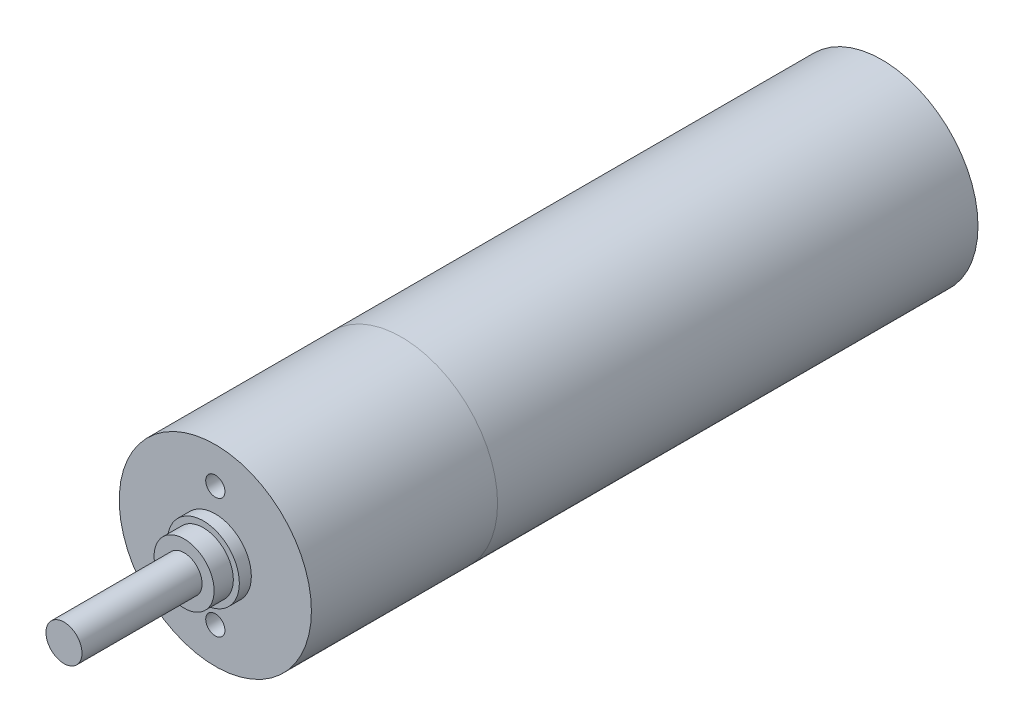
ISO-10303-21;
HEADER;
FILE_DESCRIPTION(('STEP AP214'),'2;1');
FILE_NAME('part.step','',(''),(''),'','','');
FILE_SCHEMA(('AUTOMOTIVE_DESIGN { 1 0 10303 214 1 1 1 1 }'));
ENDSEC;
DATA;
#1=APPLICATION_CONTEXT('core data for automotive mechanical design processes');
#2=APPLICATION_PROTOCOL_DEFINITION('international standard','automotive_design',2000,#1);
#3=PRODUCT_CONTEXT('',#1,'mechanical');
#4=PRODUCT('Part','Part','',(#3));
#5=PRODUCT_RELATED_PRODUCT_CATEGORY('part','',(#4));
#6=PRODUCT_DEFINITION_FORMATION('','',#4);
#7=PRODUCT_DEFINITION_CONTEXT('part definition',#1,'design');
#8=PRODUCT_DEFINITION('design','',#6,#7);
#9=PRODUCT_DEFINITION_SHAPE('','',#8);
#10=(LENGTH_UNIT() NAMED_UNIT(*) SI_UNIT(.MILLI.,.METRE.));
#11=(NAMED_UNIT(*) PLANE_ANGLE_UNIT() SI_UNIT($,.RADIAN.));
#12=(NAMED_UNIT(*) SI_UNIT($,.STERADIAN.) SOLID_ANGLE_UNIT());
#13=UNCERTAINTY_MEASURE_WITH_UNIT(LENGTH_MEASURE(1.E-05),#10,'distance_accuracy_value','');
#14=(GEOMETRIC_REPRESENTATION_CONTEXT(3) GLOBAL_UNCERTAINTY_ASSIGNED_CONTEXT((#13)) GLOBAL_UNIT_ASSIGNED_CONTEXT((#10,
#11,#12)) REPRESENTATION_CONTEXT('',''));
#15=CARTESIAN_POINT('',(0.,0.,0.));
#16=DIRECTION('',(0.,0.,1.));
#17=DIRECTION('',(1.,0.,0.));
#18=AXIS2_PLACEMENT_3D('',#15,#16,#17);
#19=CARTESIAN_POINT('',(0.,0.,58.1));
#20=DIRECTION('',(0.,0.,1.));
#21=DIRECTION('',(1.,0.,0.));
#22=AXIS2_PLACEMENT_3D('',#19,#20,#21);
#23=PLANE('',#22);
#24=CARTESIAN_POINT('',(0.,0.,58.1));
#25=DIRECTION('',(0.,0.,1.));
#26=DIRECTION('',(1.,0.,0.));
#27=AXIS2_PLACEMENT_3D('',#24,#25,#26);
#28=CIRCLE('',#27,2.5);
#29=CARTESIAN_POINT('',(2.5,0.,58.1));
#30=VERTEX_POINT('',#29);
#31=EDGE_CURVE('E84',#30,#30,#28,.T.);
#32=ORIENTED_EDGE('',*,*,#31,.T.);
#33=EDGE_LOOP('',(#32));
#34=FACE_BOUND('',#33,.T.);
#35=CARTESIAN_POINT('',(0.,0.,58.1));
#36=DIRECTION('',(0.,0.,1.));
#37=DIRECTION('',(1.,0.,0.));
#38=AXIS2_PLACEMENT_3D('',#35,#36,#37);
#39=CIRCLE('',#38,1.5);
#40=CARTESIAN_POINT('',(1.5,0.,58.1));
#41=VERTEX_POINT('',#40);
#42=EDGE_CURVE('E77',#41,#41,#39,.T.);
#43=ORIENTED_EDGE('',*,*,#42,.F.);
#44=EDGE_LOOP('',(#43));
#45=FACE_BOUND('',#44,.T.);
#46=ADVANCED_FACE('F42',(#34,#45),#23,.T.);
#47=CARTESIAN_POINT('',(0.,0.,56.5));
#48=DIRECTION('',(0.,0.,1.));
#49=DIRECTION('',(1.,0.,0.));
#50=AXIS2_PLACEMENT_3D('',#47,#48,#49);
#51=PLANE('',#50);
#52=CARTESIAN_POINT('',(0.,0.,56.5));
#53=DIRECTION('',(0.,0.,1.));
#54=DIRECTION('',(1.,0.,0.));
#55=AXIS2_PLACEMENT_3D('',#52,#53,#54);
#56=CIRCLE('',#55,3.);
#57=CARTESIAN_POINT('',(3.,0.,56.5));
#58=VERTEX_POINT('',#57);
#59=EDGE_CURVE('E90',#58,#58,#56,.T.);
#60=ORIENTED_EDGE('',*,*,#59,.T.);
#61=EDGE_LOOP('',(#60));
#62=FACE_BOUND('',#61,.T.);
#63=CARTESIAN_POINT('',(0.,0.,56.5));
#64=DIRECTION('',(0.,0.,1.));
#65=DIRECTION('',(1.,0.,0.));
#66=AXIS2_PLACEMENT_3D('',#63,#64,#65);
#67=CIRCLE('',#66,2.5);
#68=CARTESIAN_POINT('',(2.5,0.,56.5));
#69=VERTEX_POINT('',#68);
#70=EDGE_CURVE('E81',#69,#69,#67,.T.);
#71=ORIENTED_EDGE('',*,*,#70,.F.);
#72=EDGE_LOOP('',(#71));
#73=FACE_BOUND('',#72,.T.);
#74=ADVANCED_FACE('F100',(#62,#73),#51,.T.);
#75=CARTESIAN_POINT('',(0.,0.,55.5));
#76=DIRECTION('',(0.,0.,1.));
#77=DIRECTION('',(1.,0.,0.));
#78=AXIS2_PLACEMENT_3D('',#75,#76,#77);
#79=PLANE('',#78);
#80=CARTESIAN_POINT('',(0.,5.,55.5));
#81=DIRECTION('',(0.,0.,1.));
#82=DIRECTION('',(1.,0.,0.));
#83=AXIS2_PLACEMENT_3D('',#80,#81,#82);
#84=CIRCLE('',#83,0.799999999999999);
#85=CARTESIAN_POINT('',(0.799999999999999,5.,55.5));
#86=VERTEX_POINT('',#85);
#87=EDGE_CURVE('E67',#86,#86,#84,.T.);
#88=ORIENTED_EDGE('',*,*,#87,.F.);
#89=EDGE_LOOP('',(#88));
#90=FACE_BOUND('',#89,.T.);
#91=CARTESIAN_POINT('',(0.,-5.,55.5));
#92=DIRECTION('',(0.,0.,1.));
#93=DIRECTION('',(1.,0.,0.));
#94=AXIS2_PLACEMENT_3D('',#91,#92,#93);
#95=CIRCLE('',#94,0.799999999999999);
#96=CARTESIAN_POINT('',(0.799999999999999,-5.,55.5));
#97=VERTEX_POINT('',#96);
#98=EDGE_CURVE('E66',#97,#97,#95,.T.);
#99=ORIENTED_EDGE('',*,*,#98,.F.);
#100=EDGE_LOOP('',(#99));
#101=FACE_BOUND('',#100,.T.);
#102=CARTESIAN_POINT('',(0.,0.,55.5));
#103=DIRECTION('',(0.,0.,1.));
#104=DIRECTION('',(1.,0.,0.));
#105=AXIS2_PLACEMENT_3D('',#102,#103,#104);
#106=CIRCLE('',#105,8.);
#107=CARTESIAN_POINT('',(8.,0.,55.5));
#108=VERTEX_POINT('',#107);
#109=EDGE_CURVE('E12',#108,#108,#106,.T.);
#110=ORIENTED_EDGE('',*,*,#109,.T.);
#111=EDGE_LOOP('',(#110));
#112=FACE_BOUND('',#111,.T.);
#113=CARTESIAN_POINT('',(0.,0.,55.5));
#114=DIRECTION('',(0.,0.,1.));
#115=DIRECTION('',(1.,0.,0.));
#116=AXIS2_PLACEMENT_3D('',#113,#114,#115);
#117=CIRCLE('',#116,3.);
#118=CARTESIAN_POINT('',(3.,0.,55.5));
#119=VERTEX_POINT('',#118);
#120=EDGE_CURVE('E87',#119,#119,#117,.T.);
#121=ORIENTED_EDGE('',*,*,#120,.F.);
#122=EDGE_LOOP('',(#121));
#123=FACE_BOUND('',#122,.T.);
#124=ADVANCED_FACE('F98',(#90,#101,#112,#123),#79,.T.);
#125=CARTESIAN_POINT('',(0.,0.,55.5));
#126=DIRECTION('',(0.,0.,-1.));
#127=DIRECTION('',(-1.,0.,0.));
#128=AXIS2_PLACEMENT_3D('',#125,#126,#127);
#129=CYLINDRICAL_SURFACE('',#128,8.);
#130=ORIENTED_EDGE('',*,*,#109,.F.);
#131=EDGE_LOOP('',(#130));
#132=FACE_BOUND('',#131,.T.);
#133=CARTESIAN_POINT('',(0.,0.,40.));
#134=DIRECTION('',(0.,0.,1.));
#135=DIRECTION('',(1.,0.,0.));
#136=AXIS2_PLACEMENT_3D('',#133,#134,#135);
#137=CIRCLE('',#136,8.);
#138=CARTESIAN_POINT('',(8.,0.,40.));
#139=VERTEX_POINT('',#138);
#140=EDGE_CURVE('E46',#139,#139,#137,.T.);
#141=ORIENTED_EDGE('',*,*,#140,.T.);
#142=EDGE_LOOP('',(#141));
#143=FACE_BOUND('',#142,.T.);
#144=ADVANCED_FACE('F44',(#132,#143),#129,.T.);
#145=CARTESIAN_POINT('',(0.,0.,40.));
#146=DIRECTION('',(0.,0.,1.));
#147=DIRECTION('',(1.,0.,0.));
#148=AXIS2_PLACEMENT_3D('',#145,#146,#147);
#149=PLANE('',#148);
#150=ORIENTED_EDGE('',*,*,#140,.F.);
#151=EDGE_LOOP('',(#150));
#152=FACE_BOUND('',#151,.T.);
#153=ADVANCED_FACE('F107',(#152),#149,.F.);
#154=CARTESIAN_POINT('',(0.,0.,56.5));
#155=DIRECTION('',(0.,0.,-1.));
#156=DIRECTION('',(-1.,0.,0.));
#157=AXIS2_PLACEMENT_3D('',#154,#155,#156);
#158=CYLINDRICAL_SURFACE('',#157,3.);
#159=ORIENTED_EDGE('',*,*,#59,.F.);
#160=EDGE_LOOP('',(#159));
#161=FACE_BOUND('',#160,.T.);
#162=ORIENTED_EDGE('',*,*,#120,.T.);
#163=EDGE_LOOP('',(#162));
#164=FACE_BOUND('',#163,.T.);
#165=ADVANCED_FACE('F96',(#161,#164),#158,.T.);
#166=CARTESIAN_POINT('',(0.,0.,58.1));
#167=DIRECTION('',(0.,0.,-1.));
#168=DIRECTION('',(-1.,0.,0.));
#169=AXIS2_PLACEMENT_3D('',#166,#167,#168);
#170=CYLINDRICAL_SURFACE('',#169,2.5);
#171=ORIENTED_EDGE('',*,*,#31,.F.);
#172=EDGE_LOOP('',(#171));
#173=FACE_BOUND('',#172,.T.);
#174=ORIENTED_EDGE('',*,*,#70,.T.);
#175=EDGE_LOOP('',(#174));
#176=FACE_BOUND('',#175,.T.);
#177=ADVANCED_FACE('F124',(#173,#176),#170,.T.);
#178=CARTESIAN_POINT('',(0.,0.,68.1));
#179=DIRECTION('',(0.,0.,-1.));
#180=DIRECTION('',(-1.,0.,0.));
#181=AXIS2_PLACEMENT_3D('',#178,#179,#180);
#182=CYLINDRICAL_SURFACE('',#181,1.5);
#183=CARTESIAN_POINT('',(0.,0.,68.1));
#184=DIRECTION('',(0.,0.,1.));
#185=DIRECTION('',(1.,0.,0.));
#186=AXIS2_PLACEMENT_3D('',#183,#184,#185);
#187=CIRCLE('',#186,1.5);
#188=CARTESIAN_POINT('',(1.5,0.,68.1));
#189=VERTEX_POINT('',#188);
#190=EDGE_CURVE('E78',#189,#189,#187,.T.);
#191=ORIENTED_EDGE('',*,*,#190,.F.);
#192=EDGE_LOOP('',(#191));
#193=FACE_BOUND('',#192,.T.);
#194=ORIENTED_EDGE('',*,*,#42,.T.);
#195=EDGE_LOOP('',(#194));
#196=FACE_BOUND('',#195,.T.);
#197=ADVANCED_FACE('F122',(#193,#196),#182,.T.);
#198=CARTESIAN_POINT('',(0.,0.,68.1));
#199=DIRECTION('',(0.,0.,1.));
#200=DIRECTION('',(1.,0.,0.));
#201=AXIS2_PLACEMENT_3D('',#198,#199,#200);
#202=PLANE('',#201);
#203=ORIENTED_EDGE('',*,*,#190,.T.);
#204=EDGE_LOOP('',(#203));
#205=FACE_BOUND('',#204,.T.);
#206=ADVANCED_FACE('F175',(#205),#202,.T.);
#207=CARTESIAN_POINT('',(0.,-5.,52.5));
#208=DIRECTION('',(0.,0.,1.));
#209=DIRECTION('',(1.,0.,0.));
#210=AXIS2_PLACEMENT_3D('',#207,#208,#209);
#211=CONICAL_SURFACE('',#210,0.799999999999999,1.02974425867666);
#212=CARTESIAN_POINT('',(0.,-5.,52.019311504778));
#213=VERTEX_POINT('',#212);
#214=VERTEX_LOOP('',#213);
#215=FACE_BOUND('',#214,.T.);
#216=CARTESIAN_POINT('',(0.,-5.,52.5));
#217=DIRECTION('',(0.,0.,1.));
#218=DIRECTION('',(1.,0.,0.));
#219=AXIS2_PLACEMENT_3D('',#216,#217,#218);
#220=CIRCLE('',#219,0.799999999999999);
#221=CARTESIAN_POINT('',(0.799999999999999,-5.,52.5));
#222=VERTEX_POINT('',#221);
#223=EDGE_CURVE('E70',#222,#222,#220,.T.);
#224=ORIENTED_EDGE('',*,*,#223,.T.);
#225=EDGE_LOOP('',(#224));
#226=FACE_BOUND('',#225,.T.);
#227=ADVANCED_FACE('F186',(#215,#226),#211,.F.);
#228=CARTESIAN_POINT('',(0.,-5.,55.5));
#229=DIRECTION('',(0.,0.,1.));
#230=DIRECTION('',(1.,0.,0.));
#231=AXIS2_PLACEMENT_3D('',#228,#229,#230);
#232=CYLINDRICAL_SURFACE('',#231,0.799999999999999);
#233=ORIENTED_EDGE('',*,*,#223,.F.);
#234=EDGE_LOOP('',(#233));
#235=FACE_BOUND('',#234,.T.);
#236=ORIENTED_EDGE('',*,*,#98,.T.);
#237=EDGE_LOOP('',(#236));
#238=FACE_BOUND('',#237,.T.);
#239=ADVANCED_FACE('F60',(#235,#238),#232,.F.);
#240=CARTESIAN_POINT('',(0.,5.,52.5));
#241=DIRECTION('',(0.,0.,1.));
#242=DIRECTION('',(1.,0.,0.));
#243=AXIS2_PLACEMENT_3D('',#240,#241,#242);
#244=CONICAL_SURFACE('',#243,0.799999999999999,1.02974425867666);
#245=CARTESIAN_POINT('',(0.,5.,52.019311504778));
#246=VERTEX_POINT('',#245);
#247=VERTEX_LOOP('',#246);
#248=FACE_BOUND('',#247,.T.);
#249=CARTESIAN_POINT('',(0.,5.,52.5));
#250=DIRECTION('',(0.,0.,1.));
#251=DIRECTION('',(1.,0.,0.));
#252=AXIS2_PLACEMENT_3D('',#249,#250,#251);
#253=CIRCLE('',#252,0.799999999999999);
#254=CARTESIAN_POINT('',(0.799999999999999,5.,52.5));
#255=VERTEX_POINT('',#254);
#256=EDGE_CURVE('E64',#255,#255,#253,.T.);
#257=ORIENTED_EDGE('',*,*,#256,.T.);
#258=EDGE_LOOP('',(#257));
#259=FACE_BOUND('',#258,.T.);
#260=ADVANCED_FACE('F56',(#248,#259),#244,.F.);
#261=CARTESIAN_POINT('',(0.,5.,55.5));
#262=DIRECTION('',(0.,0.,1.));
#263=DIRECTION('',(1.,0.,0.));
#264=AXIS2_PLACEMENT_3D('',#261,#262,#263);
#265=CYLINDRICAL_SURFACE('',#264,0.799999999999999);
#266=ORIENTED_EDGE('',*,*,#256,.F.);
#267=EDGE_LOOP('',(#266));
#268=FACE_BOUND('',#267,.T.);
#269=ORIENTED_EDGE('',*,*,#87,.T.);
#270=EDGE_LOOP('',(#269));
#271=FACE_BOUND('',#270,.T.);
#272=ADVANCED_FACE('F59',(#268,#271),#265,.F.);
#273=CLOSED_SHELL('',(#46,#74,#124,#144,#153,#165,#177,#197,#206,#227,#239,#260,#272));
#274=MANIFOLD_SOLID_BREP('B2',#273);
#275=CARTESIAN_POINT('',(0.,0.,40.));
#276=DIRECTION('',(0.,0.,-1.));
#277=DIRECTION('',(-1.,0.,0.));
#278=AXIS2_PLACEMENT_3D('',#275,#276,#277);
#279=CYLINDRICAL_SURFACE('',#278,8.);
#280=CARTESIAN_POINT('',(0.,0.,40.));
#281=DIRECTION('',(0.,0.,1.));
#282=DIRECTION('',(1.,0.,0.));
#283=AXIS2_PLACEMENT_3D('',#280,#281,#282);
#284=CIRCLE('',#283,8.);
#285=CARTESIAN_POINT('',(8.,0.,40.));
#286=VERTEX_POINT('',#285);
#287=EDGE_CURVE('E41',#286,#286,#284,.T.);
#288=ORIENTED_EDGE('',*,*,#287,.F.);
#289=EDGE_LOOP('',(#288));
#290=FACE_BOUND('',#289,.T.);
#291=CARTESIAN_POINT('',(0.,0.,0.));
#292=DIRECTION('',(0.,0.,1.));
#293=DIRECTION('',(1.,0.,0.));
#294=AXIS2_PLACEMENT_3D('',#291,#292,#293);
#295=CIRCLE('',#294,8.);
#296=CARTESIAN_POINT('',(8.,0.,0.));
#297=VERTEX_POINT('',#296);
#298=EDGE_CURVE('E257',#297,#297,#295,.T.);
#299=ORIENTED_EDGE('',*,*,#298,.T.);
#300=EDGE_LOOP('',(#299));
#301=FACE_BOUND('',#300,.T.);
#302=ADVANCED_FACE('F254',(#290,#301),#279,.T.);
#303=CARTESIAN_POINT('',(0.,0.,40.));
#304=DIRECTION('',(0.,0.,1.));
#305=DIRECTION('',(1.,0.,0.));
#306=AXIS2_PLACEMENT_3D('',#303,#304,#305);
#307=PLANE('',#306);
#308=ORIENTED_EDGE('',*,*,#287,.T.);
#309=EDGE_LOOP('',(#308));
#310=FACE_BOUND('',#309,.T.);
#311=ADVANCED_FACE('F269',(#310),#307,.T.);
#312=CARTESIAN_POINT('',(0.,0.,0.));
#313=DIRECTION('',(0.,0.,1.));
#314=DIRECTION('',(1.,0.,0.));
#315=AXIS2_PLACEMENT_3D('',#312,#313,#314);
#316=PLANE('',#315);
#317=ORIENTED_EDGE('',*,*,#298,.F.);
#318=EDGE_LOOP('',(#317));
#319=FACE_BOUND('',#318,.T.);
#320=ADVANCED_FACE('F267',(#319),#316,.F.);
#321=CLOSED_SHELL('',(#302,#311,#320));
#322=MANIFOLD_SOLID_BREP('B6',#321);
#323=ADVANCED_BREP_SHAPE_REPRESENTATION('',(#18,#274,#322),#14);
#324=SHAPE_DEFINITION_REPRESENTATION(#9,#323);
ENDSEC;
END-ISO-10303-21;
